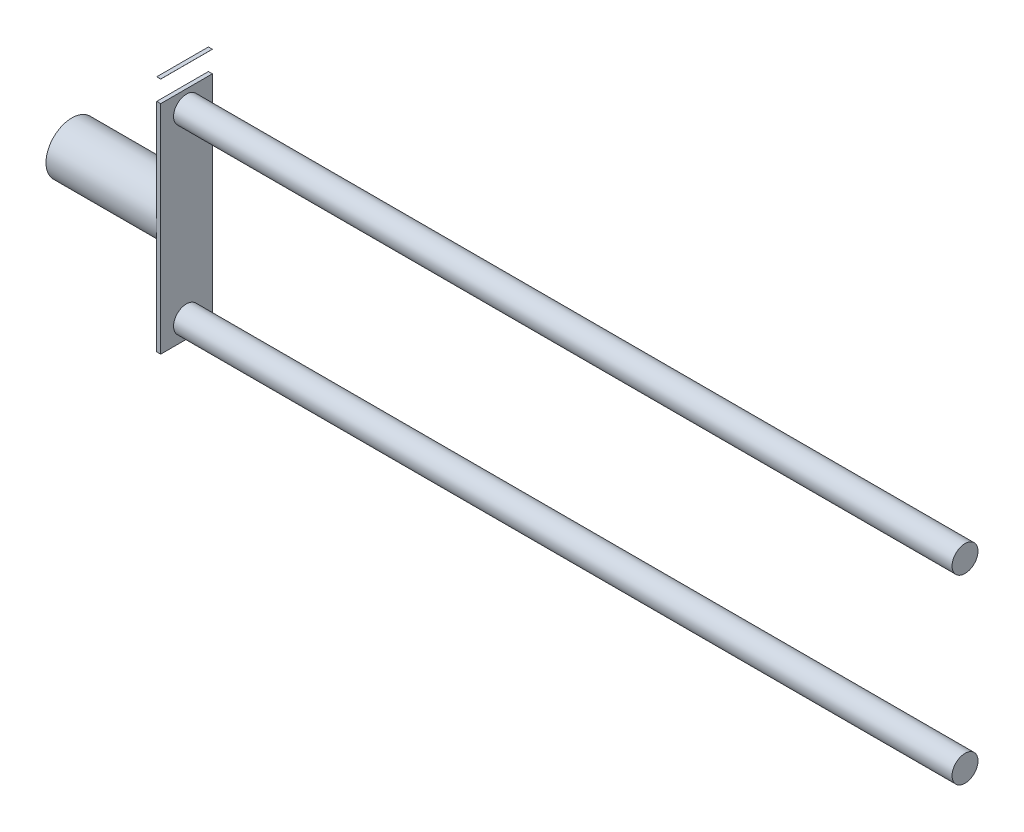
ISO-10303-21;
HEADER;
FILE_DESCRIPTION(('STEP AP214'),'2;1');
FILE_NAME('part.step','',(''),(''),'','','');
FILE_SCHEMA(('AUTOMOTIVE_DESIGN { 1 0 10303 214 1 1 1 1 }'));
ENDSEC;
DATA;
#1=APPLICATION_CONTEXT('core data for automotive mechanical design processes');
#2=APPLICATION_PROTOCOL_DEFINITION('international standard','automotive_design',2000,#1);
#3=PRODUCT_CONTEXT('',#1,'mechanical');
#4=PRODUCT('Part','Part','',(#3));
#5=PRODUCT_RELATED_PRODUCT_CATEGORY('part','',(#4));
#6=PRODUCT_DEFINITION_FORMATION('','',#4);
#7=PRODUCT_DEFINITION_CONTEXT('part definition',#1,'design');
#8=PRODUCT_DEFINITION('design','',#6,#7);
#9=PRODUCT_DEFINITION_SHAPE('','',#8);
#10=(LENGTH_UNIT() NAMED_UNIT(*) SI_UNIT(.MILLI.,.METRE.));
#11=(NAMED_UNIT(*) PLANE_ANGLE_UNIT() SI_UNIT($,.RADIAN.));
#12=(NAMED_UNIT(*) SI_UNIT($,.STERADIAN.) SOLID_ANGLE_UNIT());
#13=UNCERTAINTY_MEASURE_WITH_UNIT(LENGTH_MEASURE(1.E-05),#10,'distance_accuracy_value','');
#14=(GEOMETRIC_REPRESENTATION_CONTEXT(3) GLOBAL_UNCERTAINTY_ASSIGNED_CONTEXT((#13)) GLOBAL_UNIT_ASSIGNED_CONTEXT((#10,
#11,#12)) REPRESENTATION_CONTEXT('',''));
#15=CARTESIAN_POINT('',(0.,0.,0.));
#16=DIRECTION('',(0.,0.,1.));
#17=DIRECTION('',(1.,0.,0.));
#18=AXIS2_PLACEMENT_3D('',#15,#16,#17);
#19=CARTESIAN_POINT('',(62.1822316637417,9.95105017502917,0.));
#20=DIRECTION('',(1.,0.,0.));
#21=DIRECTION('',(0.,0.,-1.));
#22=AXIS2_PLACEMENT_3D('',#19,#20,#21);
#23=PLANE('',#22);
#24=CARTESIAN_POINT('',(62.1822316637417,0.,0.));
#25=DIRECTION('',(-1.,0.,0.));
#26=DIRECTION('',(0.,0.,1.));
#27=AXIS2_PLACEMENT_3D('',#24,#25,#26);
#28=CIRCLE('',#27,9.95105017502917);
#29=CARTESIAN_POINT('',(62.1822316637417,0.,9.95105017502917));
#30=VERTEX_POINT('',#29);
#31=EDGE_CURVE('E132',#30,#30,#28,.T.);
#32=ORIENTED_EDGE('',*,*,#31,.T.);
#33=EDGE_LOOP('',(#32));
#34=FACE_BOUND('',#33,.T.);
#35=ADVANCED_FACE('F45',(#34),#23,.F.);
#36=CARTESIAN_POINT('',(62.1822316637417,0.,0.));
#37=DIRECTION('',(-1.,0.,0.));
#38=DIRECTION('',(0.,0.,1.));
#39=AXIS2_PLACEMENT_3D('',#36,#37,#38);
#40=CYLINDRICAL_SURFACE('',#39,9.95105017502917);
#41=ORIENTED_EDGE('',*,*,#31,.F.);
#42=EDGE_LOOP('',(#41));
#43=FACE_BOUND('',#42,.T.);
#44=CARTESIAN_POINT('',(104.858606597683,0.,0.));
#45=DIRECTION('',(-1.,0.,0.));
#46=DIRECTION('',(0.,0.,1.));
#47=AXIS2_PLACEMENT_3D('',#44,#45,#46);
#48=CIRCLE('',#47,9.95105017502917);
#49=CARTESIAN_POINT('',(104.858606597683,0.,9.95105017502917));
#50=VERTEX_POINT('',#49);
#51=CARTESIAN_POINT('',(104.858606597683,0.,-9.95105017502917));
#52=VERTEX_POINT('',#51);
#53=EDGE_CURVE('E135',#50,#52,#48,.T.);
#54=ORIENTED_EDGE('',*,*,#53,.T.);
#55=EDGE_CURVE('E123',#52,#50,#48,.T.);
#56=ORIENTED_EDGE('',*,*,#55,.T.);
#57=EDGE_LOOP('',(#54,#56));
#58=FACE_BOUND('',#57,.T.);
#59=ADVANCED_FACE('F166',(#43,#58),#40,.T.);
#60=CARTESIAN_POINT('',(104.858606597683,50.,-9.95105017502917));
#61=DIRECTION('',(1.,0.,0.));
#62=DIRECTION('',(0.,0.,-1.));
#63=AXIS2_PLACEMENT_3D('',#60,#61,#62);
#64=PLANE('',#63);
#65=DIRECTION('',(0.,-1.,0.));
#66=VECTOR('',#65,1.);
#67=CARTESIAN_POINT('',(104.858606597683,50.,9.95105017502917));
#68=LINE('',#67,#66);
#69=CARTESIAN_POINT('',(104.858606597683,41.798591283,9.95105017502917));
#70=VERTEX_POINT('',#69);
#71=EDGE_CURVE('E108',#70,#50,#68,.T.);
#72=ORIENTED_EDGE('',*,*,#71,.F.);
#73=DIRECTION('',(0.,0.,-1.));
#74=VECTOR('',#73,1.);
#75=CARTESIAN_POINT('',(104.858606597683,41.798591283,-9.95105017502917));
#76=LINE('',#75,#74);
#77=CARTESIAN_POINT('',(104.858606597683,41.798591283,-9.95105017502917));
#78=VERTEX_POINT('',#77);
#79=EDGE_CURVE('E120',#70,#78,#76,.T.);
#80=ORIENTED_EDGE('',*,*,#79,.T.);
#81=DIRECTION('',(0.,-1.,0.));
#82=VECTOR('',#81,1.);
#83=CARTESIAN_POINT('',(104.858606597683,50.,-9.95105017502917));
#84=LINE('',#83,#82);
#85=EDGE_CURVE('E49',#78,#52,#84,.T.);
#86=ORIENTED_EDGE('',*,*,#85,.T.);
#87=ORIENTED_EDGE('',*,*,#53,.F.);
#88=EDGE_LOOP('',(#72,#80,#86,#87));
#89=FACE_BOUND('',#88,.T.);
#90=ADVANCED_FACE('F172',(#89),#64,.F.);
#91=CARTESIAN_POINT('',(104.858606597683,-41.8236678372127,-9.95105017502917));
#92=VERTEX_POINT('',#91);
#93=EDGE_CURVE('E125',#52,#92,#84,.T.);
#94=ORIENTED_EDGE('',*,*,#93,.T.);
#95=DIRECTION('',(0.,0.,1.));
#96=VECTOR('',#95,1.);
#97=CARTESIAN_POINT('',(104.858606597683,-41.8236678372128,-9.95105017502917));
#98=LINE('',#97,#96);
#99=CARTESIAN_POINT('',(104.858606597683,-41.8236678372128,9.95105017502917));
#100=VERTEX_POINT('',#99);
#101=EDGE_CURVE('E64',#92,#100,#98,.T.);
#102=ORIENTED_EDGE('',*,*,#101,.T.);
#103=EDGE_CURVE('E112',#50,#100,#68,.T.);
#104=ORIENTED_EDGE('',*,*,#103,.F.);
#105=ORIENTED_EDGE('',*,*,#55,.F.);
#106=EDGE_LOOP('',(#94,#102,#104,#105));
#107=FACE_BOUND('',#106,.T.);
#108=ADVANCED_FACE('F47',(#107),#64,.F.);
#109=CARTESIAN_POINT('',(104.858606597683,50.,9.95105017502917));
#110=DIRECTION('',(0.,0.,-1.));
#111=DIRECTION('',(-1.,0.,0.));
#112=AXIS2_PLACEMENT_3D('',#109,#110,#111);
#113=PLANE('',#112);
#114=ORIENTED_EDGE('',*,*,#103,.T.);
#115=DIRECTION('',(1.,0.,0.));
#116=VECTOR('',#115,1.);
#117=CARTESIAN_POINT('',(62.1822316637417,-41.8236678372128,9.95105017502917));
#118=LINE('',#117,#116);
#119=CARTESIAN_POINT('',(106.380219677848,-41.8236678372128,9.95105017502917));
#120=VERTEX_POINT('',#119);
#121=EDGE_CURVE('E111',#100,#120,#118,.T.);
#122=ORIENTED_EDGE('',*,*,#121,.T.);
#123=DIRECTION('',(0.,-1.,0.));
#124=VECTOR('',#123,1.);
#125=CARTESIAN_POINT('',(106.380219677848,50.,9.95105017502917));
#126=LINE('',#125,#124);
#127=CARTESIAN_POINT('',(106.380219677848,41.798591283,9.95105017502917));
#128=VERTEX_POINT('',#127);
#129=EDGE_CURVE('E101',#128,#120,#126,.T.);
#130=ORIENTED_EDGE('',*,*,#129,.F.);
#131=DIRECTION('',(1.,0.,0.));
#132=VECTOR('',#131,1.);
#133=CARTESIAN_POINT('',(62.1822316637417,41.798591283,9.95105017502917));
#134=LINE('',#133,#132);
#135=EDGE_CURVE('E117',#70,#128,#134,.T.);
#136=ORIENTED_EDGE('',*,*,#135,.F.);
#137=ORIENTED_EDGE('',*,*,#71,.T.);
#138=EDGE_LOOP('',(#114,#122,#130,#136,#137));
#139=FACE_BOUND('',#138,.T.);
#140=ADVANCED_FACE('F147',(#139),#113,.F.);
#141=CARTESIAN_POINT('',(106.380219677848,50.,-9.95105017502917));
#142=DIRECTION('',(-1.,0.,0.));
#143=DIRECTION('',(0.,0.,1.));
#144=AXIS2_PLACEMENT_3D('',#141,#142,#143);
#145=PLANE('',#144);
#146=CARTESIAN_POINT('',(106.380219677848,-35.,0.));
#147=DIRECTION('',(-1.,0.,0.));
#148=DIRECTION('',(0.,0.,1.));
#149=AXIS2_PLACEMENT_3D('',#146,#147,#148);
#150=CIRCLE('',#149,5.);
#151=CARTESIAN_POINT('',(106.380219677848,-35.,5.));
#152=VERTEX_POINT('',#151);
#153=EDGE_CURVE('E128',#152,#152,#150,.F.);
#154=ORIENTED_EDGE('',*,*,#153,.F.);
#155=EDGE_LOOP('',(#154));
#156=FACE_BOUND('',#155,.T.);
#157=CARTESIAN_POINT('',(106.380219677848,35.,0.));
#158=DIRECTION('',(-1.,0.,0.));
#159=DIRECTION('',(0.,0.,1.));
#160=AXIS2_PLACEMENT_3D('',#157,#158,#159);
#161=CIRCLE('',#160,5.);
#162=CARTESIAN_POINT('',(106.380219677848,35.,5.));
#163=VERTEX_POINT('',#162);
#164=EDGE_CURVE('E106',#163,#163,#161,.F.);
#165=ORIENTED_EDGE('',*,*,#164,.F.);
#166=EDGE_LOOP('',(#165));
#167=FACE_BOUND('',#166,.T.);
#168=ORIENTED_EDGE('',*,*,#129,.T.);
#169=DIRECTION('',(0.,0.,1.));
#170=VECTOR('',#169,1.);
#171=CARTESIAN_POINT('',(106.380219677848,-41.8236678372128,-9.95105017502917));
#172=LINE('',#171,#170);
#173=CARTESIAN_POINT('',(106.380219677848,-41.8236678372128,-9.95105017502917));
#174=VERTEX_POINT('',#173);
#175=EDGE_CURVE('E12',#174,#120,#172,.T.);
#176=ORIENTED_EDGE('',*,*,#175,.F.);
#177=DIRECTION('',(0.,-1.,0.));
#178=VECTOR('',#177,1.);
#179=CARTESIAN_POINT('',(106.380219677848,50.,-9.95105017502917));
#180=LINE('',#179,#178);
#181=CARTESIAN_POINT('',(106.380219677848,41.7985912830001,-9.95105017502917));
#182=VERTEX_POINT('',#181);
#183=EDGE_CURVE('E99',#182,#174,#180,.T.);
#184=ORIENTED_EDGE('',*,*,#183,.F.);
#185=DIRECTION('',(0.,0.,-1.));
#186=VECTOR('',#185,1.);
#187=CARTESIAN_POINT('',(106.380219677848,41.798591283,-9.95105017502917));
#188=LINE('',#187,#186);
#189=EDGE_CURVE('E92',#128,#182,#188,.T.);
#190=ORIENTED_EDGE('',*,*,#189,.F.);
#191=EDGE_LOOP('',(#168,#176,#184,#190));
#192=FACE_BOUND('',#191,.T.);
#193=ADVANCED_FACE('F97',(#156,#167,#192),#145,.F.);
#194=CARTESIAN_POINT('',(104.858606597683,50.,-9.95105017502917));
#195=DIRECTION('',(0.,0.,1.));
#196=DIRECTION('',(1.,0.,0.));
#197=AXIS2_PLACEMENT_3D('',#194,#195,#196);
#198=PLANE('',#197);
#199=ORIENTED_EDGE('',*,*,#183,.T.);
#200=DIRECTION('',(1.,0.,0.));
#201=VECTOR('',#200,1.);
#202=CARTESIAN_POINT('',(62.1822316637417,-41.8236678372128,-9.95105017502917));
#203=LINE('',#202,#201);
#204=EDGE_CURVE('E55',#92,#174,#203,.T.);
#205=ORIENTED_EDGE('',*,*,#204,.F.);
#206=ORIENTED_EDGE('',*,*,#93,.F.);
#207=ORIENTED_EDGE('',*,*,#85,.F.);
#208=DIRECTION('',(1.,0.,0.));
#209=VECTOR('',#208,1.);
#210=CARTESIAN_POINT('',(104.858606597683,41.798591283,-9.95105017502917));
#211=LINE('',#210,#209);
#212=EDGE_CURVE('E105',#78,#182,#211,.T.);
#213=ORIENTED_EDGE('',*,*,#212,.T.);
#214=EDGE_LOOP('',(#199,#205,#206,#207,#213));
#215=FACE_BOUND('',#214,.T.);
#216=ADVANCED_FACE('F103',(#215),#198,.F.);
#217=CARTESIAN_POINT('',(406.380219677848,35.,0.));
#218=DIRECTION('',(-1.,0.,0.));
#219=DIRECTION('',(0.,0.,1.));
#220=AXIS2_PLACEMENT_3D('',#217,#218,#219);
#221=CYLINDRICAL_SURFACE('',#220,5.);
#222=CARTESIAN_POINT('',(406.380219677848,35.,0.));
#223=DIRECTION('',(1.,0.,0.));
#224=DIRECTION('',(0.,0.,-1.));
#225=AXIS2_PLACEMENT_3D('',#222,#223,#224);
#226=CIRCLE('',#225,5.);
#227=CARTESIAN_POINT('',(406.380219677848,35.,-5.));
#228=VERTEX_POINT('',#227);
#229=EDGE_CURVE('E129',#228,#228,#226,.T.);
#230=ORIENTED_EDGE('',*,*,#229,.F.);
#231=EDGE_LOOP('',(#230));
#232=FACE_BOUND('',#231,.T.);
#233=ORIENTED_EDGE('',*,*,#164,.T.);
#234=EDGE_LOOP('',(#233));
#235=FACE_BOUND('',#234,.T.);
#236=ADVANCED_FACE('F151',(#232,#235),#221,.T.);
#237=CARTESIAN_POINT('',(406.380219677848,35.,0.));
#238=DIRECTION('',(1.,0.,0.));
#239=DIRECTION('',(0.,0.,-1.));
#240=AXIS2_PLACEMENT_3D('',#237,#238,#239);
#241=PLANE('',#240);
#242=ORIENTED_EDGE('',*,*,#229,.T.);
#243=EDGE_LOOP('',(#242));
#244=FACE_BOUND('',#243,.T.);
#245=ADVANCED_FACE('F153',(#244),#241,.T.);
#246=CARTESIAN_POINT('',(406.380219677848,-35.,0.));
#247=DIRECTION('',(-1.,0.,0.));
#248=DIRECTION('',(0.,0.,1.));
#249=AXIS2_PLACEMENT_3D('',#246,#247,#248);
#250=CYLINDRICAL_SURFACE('',#249,5.);
#251=CARTESIAN_POINT('',(406.380219677848,-35.,0.));
#252=DIRECTION('',(1.,0.,0.));
#253=DIRECTION('',(0.,0.,1.));
#254=AXIS2_PLACEMENT_3D('',#251,#252,#253);
#255=CIRCLE('',#254,5.);
#256=CARTESIAN_POINT('',(406.380219677848,-35.,5.));
#257=VERTEX_POINT('',#256);
#258=EDGE_CURVE('E119',#257,#257,#255,.T.);
#259=ORIENTED_EDGE('',*,*,#258,.F.);
#260=EDGE_LOOP('',(#259));
#261=FACE_BOUND('',#260,.T.);
#262=ORIENTED_EDGE('',*,*,#153,.T.);
#263=EDGE_LOOP('',(#262));
#264=FACE_BOUND('',#263,.T.);
#265=ADVANCED_FACE('F143',(#261,#264),#250,.T.);
#266=CARTESIAN_POINT('',(406.380219677848,-35.,0.));
#267=DIRECTION('',(-1.,0.,0.));
#268=DIRECTION('',(0.,0.,1.));
#269=AXIS2_PLACEMENT_3D('',#266,#267,#268);
#270=PLANE('',#269);
#271=ORIENTED_EDGE('',*,*,#258,.T.);
#272=EDGE_LOOP('',(#271));
#273=FACE_BOUND('',#272,.T.);
#274=ADVANCED_FACE('F189',(#273),#270,.F.);
#275=CARTESIAN_POINT('',(62.1822316637417,41.798591283,-9.95105017502917));
#276=DIRECTION('',(0.,-1.,0.));
#277=DIRECTION('',(0.,0.,-1.));
#278=AXIS2_PLACEMENT_3D('',#275,#276,#277);
#279=PLANE('',#278);
#280=ORIENTED_EDGE('',*,*,#135,.T.);
#281=ORIENTED_EDGE('',*,*,#189,.T.);
#282=ORIENTED_EDGE('',*,*,#212,.F.);
#283=ORIENTED_EDGE('',*,*,#79,.F.);
#284=EDGE_LOOP('',(#280,#281,#282,#283));
#285=FACE_BOUND('',#284,.T.);
#286=ADVANCED_FACE('F187',(#285),#279,.F.);
#287=CARTESIAN_POINT('',(62.1822316637417,-41.8236678372128,-9.95105017502917));
#288=DIRECTION('',(0.,1.,0.));
#289=DIRECTION('',(0.,0.,1.));
#290=AXIS2_PLACEMENT_3D('',#287,#288,#289);
#291=PLANE('',#290);
#292=ORIENTED_EDGE('',*,*,#204,.T.);
#293=ORIENTED_EDGE('',*,*,#175,.T.);
#294=ORIENTED_EDGE('',*,*,#121,.F.);
#295=ORIENTED_EDGE('',*,*,#101,.F.);
#296=EDGE_LOOP('',(#292,#293,#294,#295));
#297=FACE_BOUND('',#296,.T.);
#298=ADVANCED_FACE('F87',(#297),#291,.F.);
#299=CLOSED_SHELL('',(#35,#59,#90,#108,#140,#193,#216,#236,#245,#265,#274,#286,#298));
#300=MANIFOLD_SOLID_BREP('B2',#299);
#301=CARTESIAN_POINT('',(0.,50.,0.));
#302=DIRECTION('',(0.,1.,0.));
#303=DIRECTION('',(0.,0.,1.));
#304=AXIS2_PLACEMENT_3D('',#301,#302,#303);
#305=PLANE('',#304);
#306=DIRECTION('',(0.,0.,1.));
#307=VECTOR('',#306,1.);
#308=CARTESIAN_POINT('',(104.858606597683,50.,-9.95105017502917));
#309=LINE('',#308,#307);
#310=CARTESIAN_POINT('',(104.858606597683,50.,-9.95105017502917));
#311=VERTEX_POINT('',#310);
#312=CARTESIAN_POINT('',(104.858606597683,50.,9.95105017502917));
#313=VERTEX_POINT('',#312);
#314=EDGE_CURVE('E349',#311,#313,#309,.T.);
#315=ORIENTED_EDGE('',*,*,#314,.T.);
#316=DIRECTION('',(1.,0.,0.));
#317=VECTOR('',#316,1.);
#318=CARTESIAN_POINT('',(104.858606597683,50.,9.95105017502917));
#319=LINE('',#318,#317);
#320=CARTESIAN_POINT('',(106.380219677848,50.,9.95105017502917));
#321=VERTEX_POINT('',#320);
#322=EDGE_CURVE('E347',#313,#321,#319,.T.);
#323=ORIENTED_EDGE('',*,*,#322,.T.);
#324=DIRECTION('',(0.,0.,-1.));
#325=VECTOR('',#324,1.);
#326=CARTESIAN_POINT('',(106.380219677848,50.,-9.95105017502917));
#327=LINE('',#326,#325);
#328=CARTESIAN_POINT('',(106.380219677848,50.,-9.95105017502917));
#329=VERTEX_POINT('',#328);
#330=EDGE_CURVE('E337',#321,#329,#327,.T.);
#331=ORIENTED_EDGE('',*,*,#330,.T.);
#332=DIRECTION('',(-1.,0.,0.));
#333=VECTOR('',#332,1.);
#334=CARTESIAN_POINT('',(104.858606597683,50.,-9.95105017502917));
#335=LINE('',#334,#333);
#336=EDGE_CURVE('E302',#329,#311,#335,.T.);
#337=ORIENTED_EDGE('',*,*,#336,.T.);
#338=EDGE_LOOP('',(#315,#323,#331,#337));
#339=FACE_BOUND('',#338,.T.);
#340=ADVANCED_FACE('F280',(#339),#305,.T.);
#341=CARTESIAN_POINT('',(104.858606597683,50.,-9.95105017502917));
#342=DIRECTION('',(0.,0.,1.));
#343=DIRECTION('',(1.,0.,0.));
#344=AXIS2_PLACEMENT_3D('',#341,#342,#343);
#345=PLANE('',#344);
#346=DIRECTION('',(0.,-1.,0.));
#347=VECTOR('',#346,1.);
#348=CARTESIAN_POINT('',(106.380219677848,50.,-9.95105017502917));
#349=LINE('',#348,#347);
#350=CARTESIAN_POINT('',(106.380219677848,49.9749234457873,-9.95105017502917));
#351=VERTEX_POINT('',#350);
#352=EDGE_CURVE('E338',#329,#351,#349,.T.);
#353=ORIENTED_EDGE('',*,*,#352,.T.);
#354=DIRECTION('',(-1.,0.,0.));
#355=VECTOR('',#354,1.);
#356=CARTESIAN_POINT('',(104.858606597683,49.9749234457873,-9.95105017502917));
#357=LINE('',#356,#355);
#358=CARTESIAN_POINT('',(104.858606597683,49.9749234457873,-9.95105017502917));
#359=VERTEX_POINT('',#358);
#360=EDGE_CURVE('E43',#351,#359,#357,.T.);
#361=ORIENTED_EDGE('',*,*,#360,.T.);
#362=DIRECTION('',(0.,-1.,0.));
#363=VECTOR('',#362,1.);
#364=CARTESIAN_POINT('',(104.858606597683,50.,-9.95105017502917));
#365=LINE('',#364,#363);
#366=EDGE_CURVE('E340',#311,#359,#365,.T.);
#367=ORIENTED_EDGE('',*,*,#366,.F.);
#368=ORIENTED_EDGE('',*,*,#336,.F.);
#369=EDGE_LOOP('',(#353,#361,#367,#368));
#370=FACE_BOUND('',#369,.T.);
#371=ADVANCED_FACE('F354',(#370),#345,.F.);
#372=CARTESIAN_POINT('',(106.380219677848,50.,-9.95105017502917));
#373=DIRECTION('',(-1.,0.,0.));
#374=DIRECTION('',(0.,0.,1.));
#375=AXIS2_PLACEMENT_3D('',#372,#373,#374);
#376=PLANE('',#375);
#377=DIRECTION('',(0.,-1.,0.));
#378=VECTOR('',#377,1.);
#379=CARTESIAN_POINT('',(106.380219677848,50.,9.95105017502917));
#380=LINE('',#379,#378);
#381=CARTESIAN_POINT('',(106.380219677848,49.9749234457873,9.95105017502917));
#382=VERTEX_POINT('',#381);
#383=EDGE_CURVE('E332',#321,#382,#380,.T.);
#384=ORIENTED_EDGE('',*,*,#383,.T.);
#385=DIRECTION('',(0.,0.,1.));
#386=VECTOR('',#385,1.);
#387=CARTESIAN_POINT('',(106.380219677848,49.9749234457873,-9.95105017502917));
#388=LINE('',#387,#386);
#389=EDGE_CURVE('E319',#351,#382,#388,.T.);
#390=ORIENTED_EDGE('',*,*,#389,.F.);
#391=ORIENTED_EDGE('',*,*,#352,.F.);
#392=ORIENTED_EDGE('',*,*,#330,.F.);
#393=EDGE_LOOP('',(#384,#390,#391,#392));
#394=FACE_BOUND('',#393,.T.);
#395=ADVANCED_FACE('F336',(#394),#376,.F.);
#396=CARTESIAN_POINT('',(104.858606597683,50.,9.95105017502917));
#397=DIRECTION('',(0.,0.,-1.));
#398=DIRECTION('',(-1.,0.,0.));
#399=AXIS2_PLACEMENT_3D('',#396,#397,#398);
#400=PLANE('',#399);
#401=DIRECTION('',(0.,-1.,0.));
#402=VECTOR('',#401,1.);
#403=CARTESIAN_POINT('',(104.858606597683,50.,9.95105017502917));
#404=LINE('',#403,#402);
#405=CARTESIAN_POINT('',(104.858606597683,49.9749234457873,9.95105017502917));
#406=VERTEX_POINT('',#405);
#407=EDGE_CURVE('E288',#313,#406,#404,.T.);
#408=ORIENTED_EDGE('',*,*,#407,.T.);
#409=DIRECTION('',(1.,0.,0.));
#410=VECTOR('',#409,1.);
#411=CARTESIAN_POINT('',(62.1822316637417,49.9749234457873,9.95105017502917));
#412=LINE('',#411,#410);
#413=EDGE_CURVE('E322',#406,#382,#412,.T.);
#414=ORIENTED_EDGE('',*,*,#413,.T.);
#415=ORIENTED_EDGE('',*,*,#383,.F.);
#416=ORIENTED_EDGE('',*,*,#322,.F.);
#417=EDGE_LOOP('',(#408,#414,#415,#416));
#418=FACE_BOUND('',#417,.T.);
#419=ADVANCED_FACE('F331',(#418),#400,.F.);
#420=CARTESIAN_POINT('',(104.858606597683,50.,-9.95105017502917));
#421=DIRECTION('',(1.,0.,0.));
#422=DIRECTION('',(0.,0.,-1.));
#423=AXIS2_PLACEMENT_3D('',#420,#421,#422);
#424=PLANE('',#423);
#425=ORIENTED_EDGE('',*,*,#366,.T.);
#426=DIRECTION('',(0.,0.,1.));
#427=VECTOR('',#426,1.);
#428=CARTESIAN_POINT('',(104.858606597683,49.9749234457873,-9.95105017502917));
#429=LINE('',#428,#427);
#430=EDGE_CURVE('E295',#359,#406,#429,.T.);
#431=ORIENTED_EDGE('',*,*,#430,.T.);
#432=ORIENTED_EDGE('',*,*,#407,.F.);
#433=ORIENTED_EDGE('',*,*,#314,.F.);
#434=EDGE_LOOP('',(#425,#431,#432,#433));
#435=FACE_BOUND('',#434,.T.);
#436=ADVANCED_FACE('F282',(#435),#424,.F.);
#437=CARTESIAN_POINT('',(62.1822316637417,49.9749234457873,-9.95105017502917));
#438=DIRECTION('',(0.,1.,0.));
#439=DIRECTION('',(0.,0.,1.));
#440=AXIS2_PLACEMENT_3D('',#437,#438,#439);
#441=PLANE('',#440);
#442=ORIENTED_EDGE('',*,*,#360,.F.);
#443=ORIENTED_EDGE('',*,*,#389,.T.);
#444=ORIENTED_EDGE('',*,*,#413,.F.);
#445=ORIENTED_EDGE('',*,*,#430,.F.);
#446=EDGE_LOOP('',(#442,#443,#444,#445));
#447=FACE_BOUND('',#446,.T.);
#448=ADVANCED_FACE('F321',(#447),#441,.F.);
#449=CLOSED_SHELL('',(#340,#371,#395,#419,#436,#448));
#450=MANIFOLD_SOLID_BREP('B6',#449);
#451=ADVANCED_BREP_SHAPE_REPRESENTATION('',(#18,#300,#450),#14);
#452=SHAPE_DEFINITION_REPRESENTATION(#9,#451);
ENDSEC;
END-ISO-10303-21;
